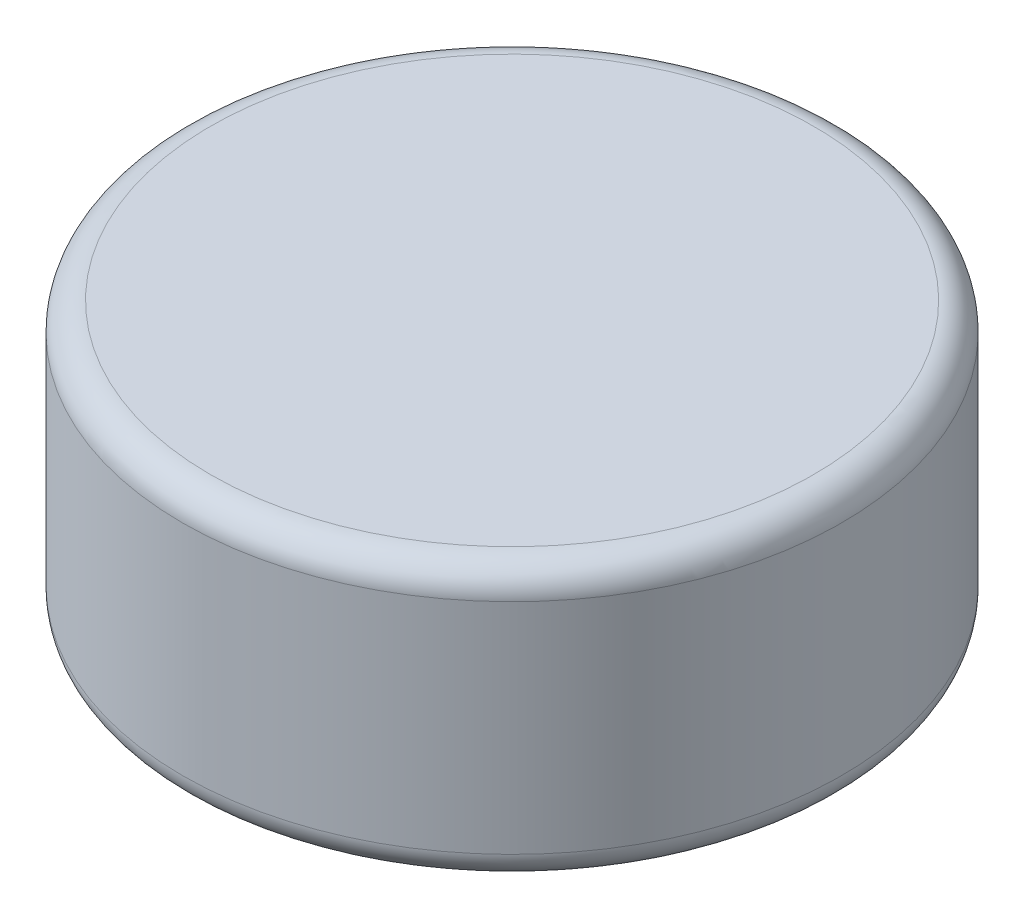
ISO-10303-21;
HEADER;
FILE_DESCRIPTION(('STEP AP214'),'2;1');
FILE_NAME('part.step','',(''),(''),'','','');
FILE_SCHEMA(('AUTOMOTIVE_DESIGN { 1 0 10303 214 1 1 1 1 }'));
ENDSEC;
DATA;
#1=APPLICATION_CONTEXT('core data for automotive mechanical design processes');
#2=APPLICATION_PROTOCOL_DEFINITION('international standard','automotive_design',2000,#1);
#3=PRODUCT_CONTEXT('',#1,'mechanical');
#4=PRODUCT('Part','Part','',(#3));
#5=PRODUCT_RELATED_PRODUCT_CATEGORY('part','',(#4));
#6=PRODUCT_DEFINITION_FORMATION('','',#4);
#7=PRODUCT_DEFINITION_CONTEXT('part definition',#1,'design');
#8=PRODUCT_DEFINITION('design','',#6,#7);
#9=PRODUCT_DEFINITION_SHAPE('','',#8);
#10=(LENGTH_UNIT() NAMED_UNIT(*) SI_UNIT(.MILLI.,.METRE.));
#11=(NAMED_UNIT(*) PLANE_ANGLE_UNIT() SI_UNIT($,.RADIAN.));
#12=(NAMED_UNIT(*) SI_UNIT($,.STERADIAN.) SOLID_ANGLE_UNIT());
#13=UNCERTAINTY_MEASURE_WITH_UNIT(LENGTH_MEASURE(1.E-05),#10,'distance_accuracy_value','');
#14=(GEOMETRIC_REPRESENTATION_CONTEXT(3) GLOBAL_UNCERTAINTY_ASSIGNED_CONTEXT((#13)) GLOBAL_UNIT_ASSIGNED_CONTEXT((#10,
#11,#12)) REPRESENTATION_CONTEXT('',''));
#15=CARTESIAN_POINT('',(0.,0.,0.));
#16=DIRECTION('',(0.,0.,1.));
#17=DIRECTION('',(1.,0.,0.));
#18=AXIS2_PLACEMENT_3D('',#15,#16,#17);
#19=CARTESIAN_POINT('',(0.,2.5,0.));
#20=DIRECTION('',(0.,-1.,0.));
#21=DIRECTION('',(0.,0.,-1.));
#22=AXIS2_PLACEMENT_3D('',#19,#20,#21);
#23=CYLINDRICAL_SURFACE('',#22,3.);
#24=CARTESIAN_POINT('',(0.,0.254,0.));
#25=DIRECTION('',(0.,1.,0.));
#26=DIRECTION('',(0.,0.,1.));
#27=AXIS2_PLACEMENT_3D('',#24,#25,#26);
#28=CIRCLE('',#27,3.);
#29=CARTESIAN_POINT('',(0.,0.254,3.));
#30=VERTEX_POINT('',#29);
#31=EDGE_CURVE('E50',#30,#30,#28,.T.);
#32=ORIENTED_EDGE('',*,*,#31,.T.);
#33=EDGE_LOOP('',(#32));
#34=FACE_BOUND('',#33,.T.);
#35=CARTESIAN_POINT('',(0.,2.246,0.));
#36=DIRECTION('',(0.,1.,0.));
#37=DIRECTION('',(0.,0.,1.));
#38=AXIS2_PLACEMENT_3D('',#35,#36,#37);
#39=CIRCLE('',#38,3.);
#40=CARTESIAN_POINT('',(0.,2.246,3.));
#41=VERTEX_POINT('',#40);
#42=EDGE_CURVE('E55',#41,#41,#39,.F.);
#43=ORIENTED_EDGE('',*,*,#42,.T.);
#44=EDGE_LOOP('',(#43));
#45=FACE_BOUND('',#44,.T.);
#46=ADVANCED_FACE('F37',(#34,#45),#23,.T.);
#47=CARTESIAN_POINT('',(0.,2.5,0.));
#48=DIRECTION('',(0.,1.,0.));
#49=DIRECTION('',(0.,0.,1.));
#50=AXIS2_PLACEMENT_3D('',#47,#48,#49);
#51=PLANE('',#50);
#52=CARTESIAN_POINT('',(0.,2.5,0.));
#53=DIRECTION('',(0.,1.,0.));
#54=DIRECTION('',(0.,0.,1.));
#55=AXIS2_PLACEMENT_3D('',#52,#53,#54);
#56=CIRCLE('',#55,2.746);
#57=CARTESIAN_POINT('',(0.,2.5,2.746));
#58=VERTEX_POINT('',#57);
#59=EDGE_CURVE('E10',#58,#58,#56,.T.);
#60=ORIENTED_EDGE('',*,*,#59,.T.);
#61=EDGE_LOOP('',(#60));
#62=FACE_BOUND('',#61,.T.);
#63=ADVANCED_FACE('F72',(#62),#51,.T.);
#64=CARTESIAN_POINT('',(0.,0.,0.));
#65=DIRECTION('',(0.,1.,0.));
#66=DIRECTION('',(0.,0.,1.));
#67=AXIS2_PLACEMENT_3D('',#64,#65,#66);
#68=PLANE('',#67);
#69=CARTESIAN_POINT('',(0.,0.,0.));
#70=DIRECTION('',(0.,1.,0.));
#71=DIRECTION('',(0.,0.,1.));
#72=AXIS2_PLACEMENT_3D('',#69,#70,#71);
#73=CIRCLE('',#72,2.746);
#74=CARTESIAN_POINT('',(0.,0.,2.746));
#75=VERTEX_POINT('',#74);
#76=EDGE_CURVE('E45',#75,#75,#73,.F.);
#77=ORIENTED_EDGE('',*,*,#76,.T.);
#78=EDGE_LOOP('',(#77));
#79=FACE_BOUND('',#78,.T.);
#80=ADVANCED_FACE('F69',(#79),#68,.F.);
#81=CARTESIAN_POINT('',(0.,0.254,0.));
#82=DIRECTION('',(0.,1.,0.));
#83=DIRECTION('',(0.,0.,1.));
#84=AXIS2_PLACEMENT_3D('',#81,#82,#83);
#85=TOROIDAL_SURFACE('',#84,2.746,0.254);
#86=ORIENTED_EDGE('',*,*,#76,.F.);
#87=EDGE_LOOP('',(#86));
#88=FACE_BOUND('',#87,.T.);
#89=ORIENTED_EDGE('',*,*,#31,.F.);
#90=EDGE_LOOP('',(#89));
#91=FACE_BOUND('',#90,.T.);
#92=ADVANCED_FACE('F65',(#88,#91),#85,.T.);
#93=CARTESIAN_POINT('',(0.,2.246,0.));
#94=DIRECTION('',(0.,1.,0.));
#95=DIRECTION('',(0.,0.,1.));
#96=AXIS2_PLACEMENT_3D('',#93,#94,#95);
#97=TOROIDAL_SURFACE('',#96,2.746,0.254);
#98=ORIENTED_EDGE('',*,*,#42,.F.);
#99=EDGE_LOOP('',(#98));
#100=FACE_BOUND('',#99,.T.);
#101=ORIENTED_EDGE('',*,*,#59,.F.);
#102=EDGE_LOOP('',(#101));
#103=FACE_BOUND('',#102,.T.);
#104=ADVANCED_FACE('F39',(#100,#103),#97,.T.);
#105=CLOSED_SHELL('',(#46,#63,#80,#92,#104));
#106=MANIFOLD_SOLID_BREP('B2',#105);
#107=ADVANCED_BREP_SHAPE_REPRESENTATION('',(#18,#106),#14);
#108=SHAPE_DEFINITION_REPRESENTATION(#9,#107);
ENDSEC;
END-ISO-10303-21;
